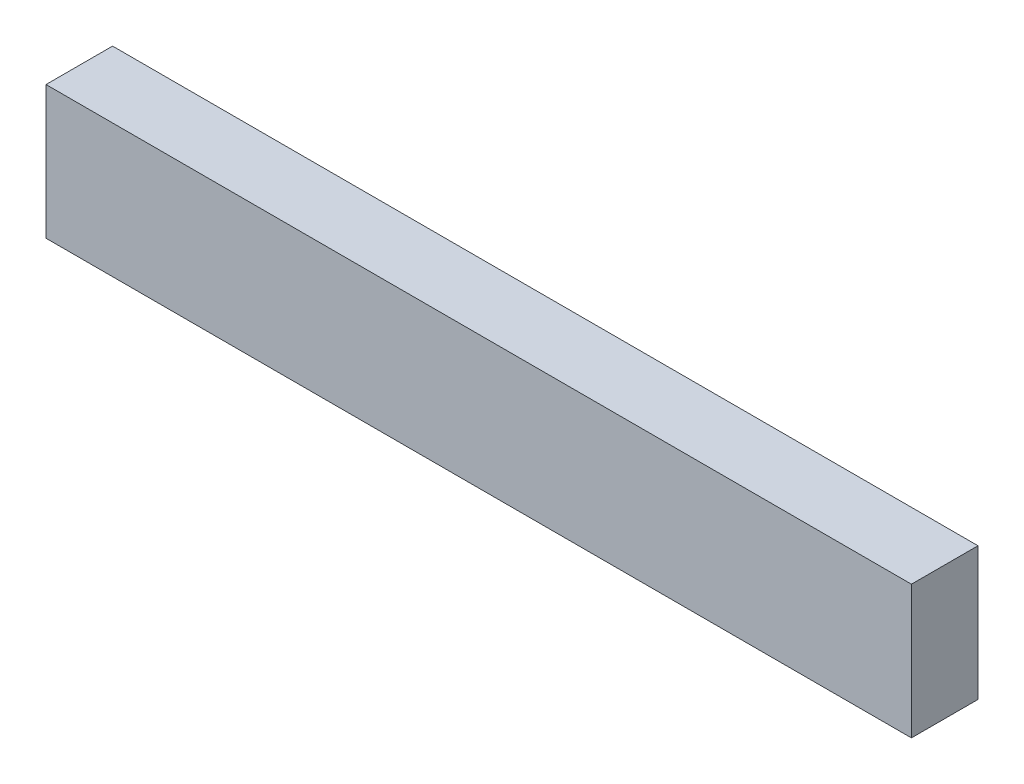
ISO-10303-21;
HEADER;
FILE_DESCRIPTION(('STEP AP214'),'2;1');
FILE_NAME('part.step','',(''),(''),'','','');
FILE_SCHEMA(('AUTOMOTIVE_DESIGN { 1 0 10303 214 1 1 1 1 }'));
ENDSEC;
DATA;
#1=APPLICATION_CONTEXT('core data for automotive mechanical design processes');
#2=APPLICATION_PROTOCOL_DEFINITION('international standard','automotive_design',2000,#1);
#3=PRODUCT_CONTEXT('',#1,'mechanical');
#4=PRODUCT('Part','Part','',(#3));
#5=PRODUCT_RELATED_PRODUCT_CATEGORY('part','',(#4));
#6=PRODUCT_DEFINITION_FORMATION('','',#4);
#7=PRODUCT_DEFINITION_CONTEXT('part definition',#1,'design');
#8=PRODUCT_DEFINITION('design','',#6,#7);
#9=PRODUCT_DEFINITION_SHAPE('','',#8);
#10=(LENGTH_UNIT() NAMED_UNIT(*) SI_UNIT(.MILLI.,.METRE.));
#11=(NAMED_UNIT(*) PLANE_ANGLE_UNIT() SI_UNIT($,.RADIAN.));
#12=(NAMED_UNIT(*) SI_UNIT($,.STERADIAN.) SOLID_ANGLE_UNIT());
#13=UNCERTAINTY_MEASURE_WITH_UNIT(LENGTH_MEASURE(1.E-05),#10,'distance_accuracy_value','');
#14=(GEOMETRIC_REPRESENTATION_CONTEXT(3) GLOBAL_UNCERTAINTY_ASSIGNED_CONTEXT((#13)) GLOBAL_UNIT_ASSIGNED_CONTEXT((#10,
#11,#12)) REPRESENTATION_CONTEXT('',''));
#15=CARTESIAN_POINT('',(0.,0.,0.));
#16=DIRECTION('',(0.,0.,1.));
#17=DIRECTION('',(1.,0.,0.));
#18=AXIS2_PLACEMENT_3D('',#15,#16,#17);
#19=CARTESIAN_POINT('',(-65.,10.,10.));
#20=DIRECTION('',(1.,0.,0.));
#21=DIRECTION('',(0.,0.,-1.));
#22=AXIS2_PLACEMENT_3D('',#19,#20,#21);
#23=PLANE('',#22);
#24=DIRECTION('',(0.,-1.,0.));
#25=VECTOR('',#24,1.);
#26=CARTESIAN_POINT('',(-65.,10.,0.));
#27=LINE('',#26,#25);
#28=CARTESIAN_POINT('',(-65.,10.,0.));
#29=VERTEX_POINT('',#28);
#30=CARTESIAN_POINT('',(-65.,-10.,0.));
#31=VERTEX_POINT('',#30);
#32=EDGE_CURVE('E96',#29,#31,#27,.T.);
#33=ORIENTED_EDGE('',*,*,#32,.T.);
#34=DIRECTION('',(0.,0.,-1.));
#35=VECTOR('',#34,1.);
#36=CARTESIAN_POINT('',(-65.,-10.,10.));
#37=LINE('',#36,#35);
#38=CARTESIAN_POINT('',(-65.,-10.,10.));
#39=VERTEX_POINT('',#38);
#40=EDGE_CURVE('E11',#39,#31,#37,.T.);
#41=ORIENTED_EDGE('',*,*,#40,.F.);
#42=DIRECTION('',(0.,-1.,0.));
#43=VECTOR('',#42,1.);
#44=CARTESIAN_POINT('',(-65.,10.,10.));
#45=LINE('',#44,#43);
#46=CARTESIAN_POINT('',(-65.,10.,10.));
#47=VERTEX_POINT('',#46);
#48=EDGE_CURVE('E84',#47,#39,#45,.T.);
#49=ORIENTED_EDGE('',*,*,#48,.F.);
#50=DIRECTION('',(0.,0.,-1.));
#51=VECTOR('',#50,1.);
#52=CARTESIAN_POINT('',(-65.,10.,10.));
#53=LINE('',#52,#51);
#54=EDGE_CURVE('E92',#47,#29,#53,.T.);
#55=ORIENTED_EDGE('',*,*,#54,.T.);
#56=EDGE_LOOP('',(#33,#41,#49,#55));
#57=FACE_BOUND('',#56,.T.);
#58=ADVANCED_FACE('F33',(#57),#23,.F.);
#59=CARTESIAN_POINT('',(-65.,-10.,10.));
#60=DIRECTION('',(0.,1.,0.));
#61=DIRECTION('',(0.,0.,1.));
#62=AXIS2_PLACEMENT_3D('',#59,#60,#61);
#63=PLANE('',#62);
#64=DIRECTION('',(1.,0.,0.));
#65=VECTOR('',#64,1.);
#66=CARTESIAN_POINT('',(-65.,-10.,0.));
#67=LINE('',#66,#65);
#68=CARTESIAN_POINT('',(65.,-10.,0.));
#69=VERTEX_POINT('',#68);
#70=EDGE_CURVE('E88',#31,#69,#67,.T.);
#71=ORIENTED_EDGE('',*,*,#70,.T.);
#72=DIRECTION('',(0.,0.,-1.));
#73=VECTOR('',#72,1.);
#74=CARTESIAN_POINT('',(65.,-10.,10.));
#75=LINE('',#74,#73);
#76=CARTESIAN_POINT('',(65.,-10.,10.));
#77=VERTEX_POINT('',#76);
#78=EDGE_CURVE('E41',#77,#69,#75,.T.);
#79=ORIENTED_EDGE('',*,*,#78,.F.);
#80=DIRECTION('',(1.,0.,0.));
#81=VECTOR('',#80,1.);
#82=CARTESIAN_POINT('',(-65.,-10.,10.));
#83=LINE('',#82,#81);
#84=EDGE_CURVE('E79',#39,#77,#83,.T.);
#85=ORIENTED_EDGE('',*,*,#84,.F.);
#86=ORIENTED_EDGE('',*,*,#40,.T.);
#87=EDGE_LOOP('',(#71,#79,#85,#86));
#88=FACE_BOUND('',#87,.T.);
#89=ADVANCED_FACE('F87',(#88),#63,.F.);
#90=CARTESIAN_POINT('',(65.,10.,10.));
#91=DIRECTION('',(-1.,0.,0.));
#92=DIRECTION('',(0.,-1.,0.));
#93=AXIS2_PLACEMENT_3D('',#90,#91,#92);
#94=PLANE('',#93);
#95=DIRECTION('',(0.,1.,0.));
#96=VECTOR('',#95,1.);
#97=CARTESIAN_POINT('',(65.,10.,0.));
#98=LINE('',#97,#96);
#99=CARTESIAN_POINT('',(65.,10.,0.));
#100=VERTEX_POINT('',#99);
#101=EDGE_CURVE('E66',#69,#100,#98,.T.);
#102=ORIENTED_EDGE('',*,*,#101,.T.);
#103=DIRECTION('',(0.,0.,-1.));
#104=VECTOR('',#103,1.);
#105=CARTESIAN_POINT('',(65.,10.,10.));
#106=LINE('',#105,#104);
#107=CARTESIAN_POINT('',(65.,10.,10.));
#108=VERTEX_POINT('',#107);
#109=EDGE_CURVE('E89',#108,#100,#106,.T.);
#110=ORIENTED_EDGE('',*,*,#109,.F.);
#111=DIRECTION('',(0.,1.,0.));
#112=VECTOR('',#111,1.);
#113=CARTESIAN_POINT('',(65.,10.,10.));
#114=LINE('',#113,#112);
#115=EDGE_CURVE('E82',#77,#108,#114,.T.);
#116=ORIENTED_EDGE('',*,*,#115,.F.);
#117=ORIENTED_EDGE('',*,*,#78,.T.);
#118=EDGE_LOOP('',(#102,#110,#116,#117));
#119=FACE_BOUND('',#118,.T.);
#120=ADVANCED_FACE('F90',(#119),#94,.F.);
#121=CARTESIAN_POINT('',(-65.,10.,10.));
#122=DIRECTION('',(0.,-1.,0.));
#123=DIRECTION('',(0.,0.,-1.));
#124=AXIS2_PLACEMENT_3D('',#121,#122,#123);
#125=PLANE('',#124);
#126=DIRECTION('',(-1.,0.,0.));
#127=VECTOR('',#126,1.);
#128=CARTESIAN_POINT('',(-65.,10.,0.));
#129=LINE('',#128,#127);
#130=EDGE_CURVE('E72',#100,#29,#129,.T.);
#131=ORIENTED_EDGE('',*,*,#130,.T.);
#132=ORIENTED_EDGE('',*,*,#54,.F.);
#133=DIRECTION('',(-1.,0.,0.));
#134=VECTOR('',#133,1.);
#135=CARTESIAN_POINT('',(-65.,10.,10.));
#136=LINE('',#135,#134);
#137=EDGE_CURVE('E49',#108,#47,#136,.T.);
#138=ORIENTED_EDGE('',*,*,#137,.F.);
#139=ORIENTED_EDGE('',*,*,#109,.T.);
#140=EDGE_LOOP('',(#131,#132,#138,#139));
#141=FACE_BOUND('',#140,.T.);
#142=ADVANCED_FACE('F103',(#141),#125,.F.);
#143=CARTESIAN_POINT('',(0.,0.,10.));
#144=DIRECTION('',(0.,0.,1.));
#145=DIRECTION('',(1.,0.,0.));
#146=AXIS2_PLACEMENT_3D('',#143,#144,#145);
#147=PLANE('',#146);
#148=ORIENTED_EDGE('',*,*,#48,.T.);
#149=ORIENTED_EDGE('',*,*,#84,.T.);
#150=ORIENTED_EDGE('',*,*,#115,.T.);
#151=ORIENTED_EDGE('',*,*,#137,.T.);
#152=EDGE_LOOP('',(#148,#149,#150,#151));
#153=FACE_BOUND('',#152,.T.);
#154=ADVANCED_FACE('F80',(#153),#147,.T.);
#155=CARTESIAN_POINT('',(0.,0.,0.));
#156=DIRECTION('',(0.,0.,1.));
#157=DIRECTION('',(1.,0.,0.));
#158=AXIS2_PLACEMENT_3D('',#155,#156,#157);
#159=PLANE('',#158);
#160=ORIENTED_EDGE('',*,*,#32,.F.);
#161=ORIENTED_EDGE('',*,*,#130,.F.);
#162=ORIENTED_EDGE('',*,*,#101,.F.);
#163=ORIENTED_EDGE('',*,*,#70,.F.);
#164=EDGE_LOOP('',(#160,#161,#162,#163));
#165=FACE_BOUND('',#164,.T.);
#166=ADVANCED_FACE('F106',(#165),#159,.F.);
#167=CLOSED_SHELL('',(#58,#89,#120,#142,#154,#166));
#168=MANIFOLD_SOLID_BREP('B2',#167);
#169=ADVANCED_BREP_SHAPE_REPRESENTATION('',(#18,#168),#14);
#170=SHAPE_DEFINITION_REPRESENTATION(#9,#169);
ENDSEC;
END-ISO-10303-21;
